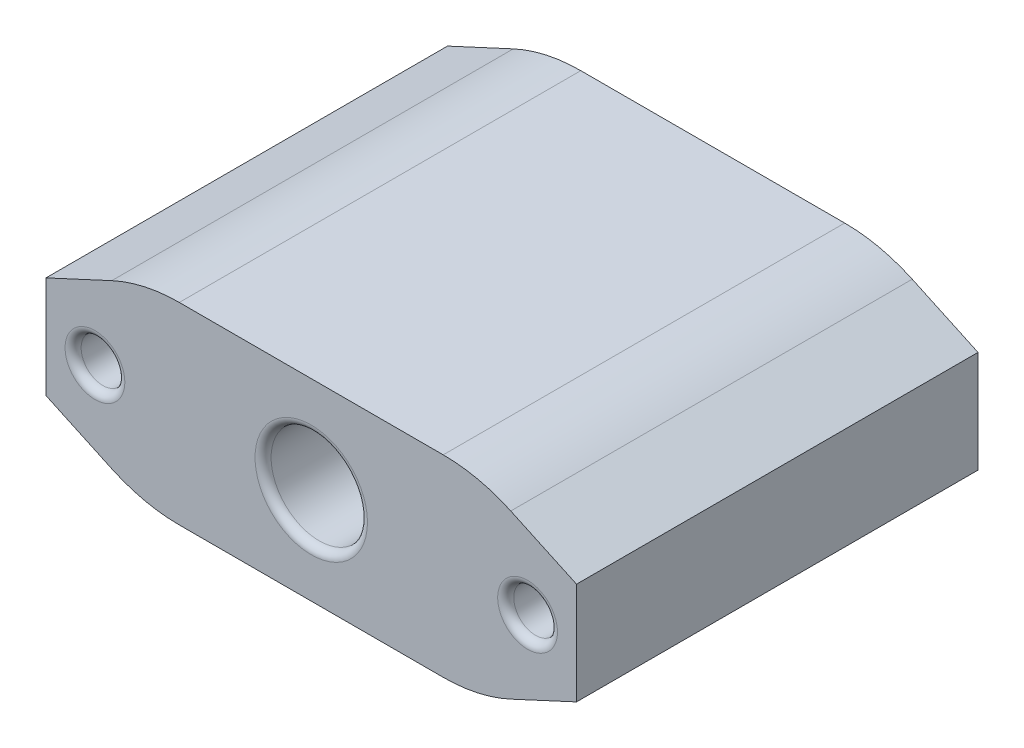
ISO-10303-21;
HEADER;
FILE_DESCRIPTION(('STEP AP214'),'2;1');
FILE_NAME('part.step','',(''),(''),'','','');
FILE_SCHEMA(('AUTOMOTIVE_DESIGN { 1 0 10303 214 1 1 1 1 }'));
ENDSEC;
DATA;
#1=APPLICATION_CONTEXT('core data for automotive mechanical design processes');
#2=APPLICATION_PROTOCOL_DEFINITION('international standard','automotive_design',2000,#1);
#3=PRODUCT_CONTEXT('',#1,'mechanical');
#4=PRODUCT('Part','Part','',(#3));
#5=PRODUCT_RELATED_PRODUCT_CATEGORY('part','',(#4));
#6=PRODUCT_DEFINITION_FORMATION('','',#4);
#7=PRODUCT_DEFINITION_CONTEXT('part definition',#1,'design');
#8=PRODUCT_DEFINITION('design','',#6,#7);
#9=PRODUCT_DEFINITION_SHAPE('','',#8);
#10=(LENGTH_UNIT() NAMED_UNIT(*) SI_UNIT(.MILLI.,.METRE.));
#11=(NAMED_UNIT(*) PLANE_ANGLE_UNIT() SI_UNIT($,.RADIAN.));
#12=(NAMED_UNIT(*) SI_UNIT($,.STERADIAN.) SOLID_ANGLE_UNIT());
#13=UNCERTAINTY_MEASURE_WITH_UNIT(LENGTH_MEASURE(1.E-05),#10,'distance_accuracy_value','');
#14=(GEOMETRIC_REPRESENTATION_CONTEXT(3) GLOBAL_UNCERTAINTY_ASSIGNED_CONTEXT((#13)) GLOBAL_UNIT_ASSIGNED_CONTEXT((#10,
#11,#12)) REPRESENTATION_CONTEXT('',''));
#15=CARTESIAN_POINT('',(0.,0.,0.));
#16=DIRECTION('',(0.,0.,1.));
#17=DIRECTION('',(1.,0.,0.));
#18=AXIS2_PLACEMENT_3D('',#15,#16,#17);
#19=CARTESIAN_POINT('',(0.,0.,25.));
#20=DIRECTION('',(0.,0.,1.));
#21=DIRECTION('',(1.,0.,0.));
#22=AXIS2_PLACEMENT_3D('',#19,#20,#21);
#23=PLANE('',#22);
#24=CARTESIAN_POINT('',(-13.4699746100887,0.,25.));
#25=DIRECTION('',(0.,0.,1.));
#26=DIRECTION('',(1.,0.,0.));
#27=AXIS2_PLACEMENT_3D('',#24,#25,#26);
#28=CIRCLE('',#27,1.8609341816038);
#29=CARTESIAN_POINT('',(-11.6090404284849,0.,25.));
#30=VERTEX_POINT('',#29);
#31=EDGE_CURVE('E11',#30,#30,#28,.F.);
#32=ORIENTED_EDGE('',*,*,#31,.T.);
#33=EDGE_LOOP('',(#32));
#34=FACE_BOUND('',#33,.T.);
#35=CARTESIAN_POINT('',(13.4699746100887,0.,25.));
#36=DIRECTION('',(0.,0.,1.));
#37=DIRECTION('',(1.,0.,0.));
#38=AXIS2_PLACEMENT_3D('',#35,#36,#37);
#39=CIRCLE('',#38,1.86093418160381);
#40=CARTESIAN_POINT('',(15.3309087916925,0.,25.));
#41=VERTEX_POINT('',#40);
#42=EDGE_CURVE('E250',#41,#41,#39,.F.);
#43=ORIENTED_EDGE('',*,*,#42,.T.);
#44=EDGE_LOOP('',(#43));
#45=FACE_BOUND('',#44,.T.);
#46=CARTESIAN_POINT('',(0.,0.,25.));
#47=DIRECTION('',(0.,0.,1.));
#48=DIRECTION('',(1.,0.,0.));
#49=AXIS2_PLACEMENT_3D('',#46,#47,#48);
#50=CIRCLE('',#49,3.5);
#51=CARTESIAN_POINT('',(3.5,0.,25.));
#52=VERTEX_POINT('',#51);
#53=EDGE_CURVE('E244',#52,#52,#50,.F.);
#54=ORIENTED_EDGE('',*,*,#53,.T.);
#55=EDGE_LOOP('',(#54));
#56=FACE_BOUND('',#55,.T.);
#57=DIRECTION('',(-0.907309221661338,0.420464001180003,0.));
#58=VECTOR('',#57,1.);
#59=CARTESIAN_POINT('',(16.5179746100887,3.17499999999998,25.));
#60=LINE('',#59,#58);
#61=CARTESIAN_POINT('',(16.5179746100887,3.17499999999998,25.));
#62=VERTEX_POINT('',#61);
#63=CARTESIAN_POINT('',(12.4221267685046,5.07309221661338,25.));
#64=VERTEX_POINT('',#63);
#65=EDGE_CURVE('E154',#62,#64,#60,.T.);
#66=ORIENTED_EDGE('',*,*,#65,.T.);
#67=CARTESIAN_POINT('',(8.21748675670452,-3.99999999999999,25.));
#68=DIRECTION('',(0.,0.,1.));
#69=DIRECTION('',(1.,0.,0.));
#70=AXIS2_PLACEMENT_3D('',#67,#68,#69);
#71=CIRCLE('',#70,10.);
#72=CARTESIAN_POINT('',(8.21748675670452,6.00000000000001,25.));
#73=VERTEX_POINT('',#72);
#74=EDGE_CURVE('E221',#64,#73,#71,.T.);
#75=ORIENTED_EDGE('',*,*,#74,.T.);
#76=DIRECTION('',(-1.,0.,0.));
#77=VECTOR('',#76,1.);
#78=CARTESIAN_POINT('',(-10.4219746100887,6.00000000000001,25.));
#79=LINE('',#78,#77);
#80=CARTESIAN_POINT('',(-8.21748675670453,6.00000000000001,25.));
#81=VERTEX_POINT('',#80);
#82=EDGE_CURVE('E156',#73,#81,#79,.T.);
#83=ORIENTED_EDGE('',*,*,#82,.T.);
#84=CARTESIAN_POINT('',(-8.21748675670453,-3.99999999999999,25.));
#85=DIRECTION('',(0.,0.,1.));
#86=DIRECTION('',(1.,0.,0.));
#87=AXIS2_PLACEMENT_3D('',#84,#85,#86);
#88=CIRCLE('',#87,10.);
#89=CARTESIAN_POINT('',(-12.4221267685046,5.07309221661338,25.));
#90=VERTEX_POINT('',#89);
#91=EDGE_CURVE('E198',#81,#90,#88,.T.);
#92=ORIENTED_EDGE('',*,*,#91,.T.);
#93=DIRECTION('',(-0.907309221661338,-0.420464001180003,0.));
#94=VECTOR('',#93,1.);
#95=CARTESIAN_POINT('',(-16.5179746100887,3.17499999999998,25.));
#96=LINE('',#95,#94);
#97=CARTESIAN_POINT('',(-16.5179746100887,3.17499999999998,25.));
#98=VERTEX_POINT('',#97);
#99=EDGE_CURVE('E161',#90,#98,#96,.T.);
#100=ORIENTED_EDGE('',*,*,#99,.T.);
#101=DIRECTION('',(0.,-1.,0.));
#102=VECTOR('',#101,1.);
#103=CARTESIAN_POINT('',(-16.5179746100887,-3.17500000000004,25.));
#104=LINE('',#103,#102);
#105=CARTESIAN_POINT('',(-16.5179746100887,-3.17500000000004,25.));
#106=VERTEX_POINT('',#105);
#107=EDGE_CURVE('E163',#98,#106,#104,.T.);
#108=ORIENTED_EDGE('',*,*,#107,.T.);
#109=DIRECTION('',(0.907309221661341,-0.420464001179996,0.));
#110=VECTOR('',#109,1.);
#111=CARTESIAN_POINT('',(-16.5179746100887,-3.17500000000004,25.));
#112=LINE('',#111,#110);
#113=CARTESIAN_POINT('',(-12.4221267685045,-5.07309221661342,25.));
#114=VERTEX_POINT('',#113);
#115=EDGE_CURVE('E183',#106,#114,#112,.T.);
#116=ORIENTED_EDGE('',*,*,#115,.T.);
#117=CARTESIAN_POINT('',(-8.21748675670456,3.99999999999999,25.));
#118=DIRECTION('',(0.,0.,1.));
#119=DIRECTION('',(1.,0.,0.));
#120=AXIS2_PLACEMENT_3D('',#117,#118,#119);
#121=CIRCLE('',#120,10.);
#122=CARTESIAN_POINT('',(-8.21748675670456,-6.00000000000001,25.));
#123=VERTEX_POINT('',#122);
#124=EDGE_CURVE('E207',#114,#123,#121,.T.);
#125=ORIENTED_EDGE('',*,*,#124,.T.);
#126=DIRECTION('',(1.,0.,0.));
#127=VECTOR('',#126,1.);
#128=CARTESIAN_POINT('',(-10.4219746100887,-6.00000000000001,25.));
#129=LINE('',#128,#127);
#130=CARTESIAN_POINT('',(8.21748675670456,-6.00000000000001,25.));
#131=VERTEX_POINT('',#130);
#132=EDGE_CURVE('E140',#123,#131,#129,.T.);
#133=ORIENTED_EDGE('',*,*,#132,.T.);
#134=CARTESIAN_POINT('',(8.21748675670456,3.99999999999999,25.));
#135=DIRECTION('',(0.,0.,1.));
#136=DIRECTION('',(1.,0.,0.));
#137=AXIS2_PLACEMENT_3D('',#134,#135,#136);
#138=CIRCLE('',#137,10.);
#139=CARTESIAN_POINT('',(12.4221267685045,-5.07309221661342,25.));
#140=VERTEX_POINT('',#139);
#141=EDGE_CURVE('E136',#131,#140,#138,.T.);
#142=ORIENTED_EDGE('',*,*,#141,.T.);
#143=DIRECTION('',(0.907309221661341,0.420464001179996,0.));
#144=VECTOR('',#143,1.);
#145=CARTESIAN_POINT('',(16.5179746100887,-3.17500000000004,25.));
#146=LINE('',#145,#144);
#147=CARTESIAN_POINT('',(16.5179746100887,-3.17500000000004,25.));
#148=VERTEX_POINT('',#147);
#149=EDGE_CURVE('E129',#140,#148,#146,.T.);
#150=ORIENTED_EDGE('',*,*,#149,.T.);
#151=DIRECTION('',(0.,1.,0.));
#152=VECTOR('',#151,1.);
#153=CARTESIAN_POINT('',(16.5179746100887,-3.17500000000004,25.));
#154=LINE('',#153,#152);
#155=EDGE_CURVE('E132',#148,#62,#154,.T.);
#156=ORIENTED_EDGE('',*,*,#155,.T.);
#157=EDGE_LOOP('',(#66,#75,#83,#92,#100,#108,#116,#125,#133,#142,#150,#156));
#158=FACE_BOUND('',#157,.T.);
#159=ADVANCED_FACE('F39',(#34,#45,#56,#158),#23,.T.);
#160=CARTESIAN_POINT('',(0.,0.,0.));
#161=DIRECTION('',(0.,0.,1.));
#162=DIRECTION('',(1.,0.,0.));
#163=AXIS2_PLACEMENT_3D('',#160,#161,#162);
#164=PLANE('',#163);
#165=CARTESIAN_POINT('',(-13.4699746100887,0.,0.));
#166=DIRECTION('',(0.,0.,1.));
#167=DIRECTION('',(1.,0.,0.));
#168=AXIS2_PLACEMENT_3D('',#165,#166,#167);
#169=CIRCLE('',#168,1.8609341816038);
#170=CARTESIAN_POINT('',(-11.6090404284849,0.,0.));
#171=VERTEX_POINT('',#170);
#172=EDGE_CURVE('E235',#171,#171,#169,.T.);
#173=ORIENTED_EDGE('',*,*,#172,.T.);
#174=EDGE_LOOP('',(#173));
#175=FACE_BOUND('',#174,.T.);
#176=CARTESIAN_POINT('',(13.4699746100887,0.,0.));
#177=DIRECTION('',(0.,0.,1.));
#178=DIRECTION('',(1.,0.,0.));
#179=AXIS2_PLACEMENT_3D('',#176,#177,#178);
#180=CIRCLE('',#179,1.86093418160381);
#181=CARTESIAN_POINT('',(15.3309087916925,0.,0.));
#182=VERTEX_POINT('',#181);
#183=EDGE_CURVE('E229',#182,#182,#180,.T.);
#184=ORIENTED_EDGE('',*,*,#183,.T.);
#185=EDGE_LOOP('',(#184));
#186=FACE_BOUND('',#185,.T.);
#187=CARTESIAN_POINT('',(0.,0.,0.));
#188=DIRECTION('',(0.,0.,1.));
#189=DIRECTION('',(1.,0.,0.));
#190=AXIS2_PLACEMENT_3D('',#187,#188,#189);
#191=CIRCLE('',#190,3.5);
#192=CARTESIAN_POINT('',(3.5,0.,0.));
#193=VERTEX_POINT('',#192);
#194=EDGE_CURVE('E223',#193,#193,#191,.T.);
#195=ORIENTED_EDGE('',*,*,#194,.T.);
#196=EDGE_LOOP('',(#195));
#197=FACE_BOUND('',#196,.T.);
#198=DIRECTION('',(-1.,0.,0.));
#199=VECTOR('',#198,1.);
#200=CARTESIAN_POINT('',(-10.4219746100887,6.00000000000001,0.));
#201=LINE('',#200,#199);
#202=CARTESIAN_POINT('',(8.21748675670452,6.00000000000001,0.));
#203=VERTEX_POINT('',#202);
#204=CARTESIAN_POINT('',(-8.21748675670453,6.00000000000001,0.));
#205=VERTEX_POINT('',#204);
#206=EDGE_CURVE('E177',#203,#205,#201,.T.);
#207=ORIENTED_EDGE('',*,*,#206,.F.);
#208=CARTESIAN_POINT('',(8.21748675670452,-3.99999999999999,0.));
#209=DIRECTION('',(0.,0.,1.));
#210=DIRECTION('',(1.,0.,0.));
#211=AXIS2_PLACEMENT_3D('',#208,#209,#210);
#212=CIRCLE('',#211,10.);
#213=CARTESIAN_POINT('',(12.4221267685046,5.07309221661338,0.));
#214=VERTEX_POINT('',#213);
#215=EDGE_CURVE('E62',#203,#214,#212,.F.);
#216=ORIENTED_EDGE('',*,*,#215,.T.);
#217=DIRECTION('',(-0.907309221661338,0.420464001180003,0.));
#218=VECTOR('',#217,1.);
#219=CARTESIAN_POINT('',(16.5179746100887,3.17499999999998,0.));
#220=LINE('',#219,#218);
#221=CARTESIAN_POINT('',(16.5179746100887,3.17499999999998,0.));
#222=VERTEX_POINT('',#221);
#223=EDGE_CURVE('E175',#222,#214,#220,.T.);
#224=ORIENTED_EDGE('',*,*,#223,.F.);
#225=DIRECTION('',(0.,1.,0.));
#226=VECTOR('',#225,1.);
#227=CARTESIAN_POINT('',(16.5179746100887,-3.17500000000004,0.));
#228=LINE('',#227,#226);
#229=CARTESIAN_POINT('',(16.5179746100887,-3.17500000000004,0.));
#230=VERTEX_POINT('',#229);
#231=EDGE_CURVE('E173',#230,#222,#228,.T.);
#232=ORIENTED_EDGE('',*,*,#231,.F.);
#233=DIRECTION('',(0.907309221661341,0.420464001179996,0.));
#234=VECTOR('',#233,1.);
#235=CARTESIAN_POINT('',(16.5179746100887,-3.17500000000004,0.));
#236=LINE('',#235,#234);
#237=CARTESIAN_POINT('',(12.4221267685045,-5.07309221661342,0.));
#238=VERTEX_POINT('',#237);
#239=EDGE_CURVE('E146',#238,#230,#236,.T.);
#240=ORIENTED_EDGE('',*,*,#239,.F.);
#241=CARTESIAN_POINT('',(8.21748675670456,3.99999999999999,0.));
#242=DIRECTION('',(0.,0.,1.));
#243=DIRECTION('',(1.,0.,0.));
#244=AXIS2_PLACEMENT_3D('',#241,#242,#243);
#245=CIRCLE('',#244,10.);
#246=CARTESIAN_POINT('',(8.21748675670456,-6.00000000000001,0.));
#247=VERTEX_POINT('',#246);
#248=EDGE_CURVE('E211',#238,#247,#245,.F.);
#249=ORIENTED_EDGE('',*,*,#248,.T.);
#250=DIRECTION('',(1.,0.,0.));
#251=VECTOR('',#250,1.);
#252=CARTESIAN_POINT('',(-10.4219746100887,-6.00000000000001,0.));
#253=LINE('',#252,#251);
#254=CARTESIAN_POINT('',(-8.21748675670456,-6.00000000000001,0.));
#255=VERTEX_POINT('',#254);
#256=EDGE_CURVE('E169',#255,#247,#253,.T.);
#257=ORIENTED_EDGE('',*,*,#256,.F.);
#258=CARTESIAN_POINT('',(-8.21748675670456,3.99999999999999,0.));
#259=DIRECTION('',(0.,0.,1.));
#260=DIRECTION('',(1.,0.,0.));
#261=AXIS2_PLACEMENT_3D('',#258,#259,#260);
#262=CIRCLE('',#261,10.);
#263=CARTESIAN_POINT('',(-12.4221267685045,-5.07309221661342,0.));
#264=VERTEX_POINT('',#263);
#265=EDGE_CURVE('E203',#255,#264,#262,.F.);
#266=ORIENTED_EDGE('',*,*,#265,.T.);
#267=DIRECTION('',(0.907309221661341,-0.420464001179996,0.));
#268=VECTOR('',#267,1.);
#269=CARTESIAN_POINT('',(-16.5179746100887,-3.17500000000004,0.));
#270=LINE('',#269,#268);
#271=CARTESIAN_POINT('',(-16.5179746100887,-3.17500000000004,0.));
#272=VERTEX_POINT('',#271);
#273=EDGE_CURVE('E166',#272,#264,#270,.T.);
#274=ORIENTED_EDGE('',*,*,#273,.F.);
#275=DIRECTION('',(0.,-1.,0.));
#276=VECTOR('',#275,1.);
#277=CARTESIAN_POINT('',(-16.5179746100887,-3.17500000000004,0.));
#278=LINE('',#277,#276);
#279=CARTESIAN_POINT('',(-16.5179746100887,3.17499999999998,0.));
#280=VERTEX_POINT('',#279);
#281=EDGE_CURVE('E181',#280,#272,#278,.T.);
#282=ORIENTED_EDGE('',*,*,#281,.F.);
#283=DIRECTION('',(-0.907309221661338,-0.420464001180003,0.));
#284=VECTOR('',#283,1.);
#285=CARTESIAN_POINT('',(-16.5179746100887,3.17499999999998,0.));
#286=LINE('',#285,#284);
#287=CARTESIAN_POINT('',(-12.4221267685046,5.07309221661338,0.));
#288=VERTEX_POINT('',#287);
#289=EDGE_CURVE('E179',#288,#280,#286,.T.);
#290=ORIENTED_EDGE('',*,*,#289,.F.);
#291=CARTESIAN_POINT('',(-8.21748675670453,-3.99999999999999,0.));
#292=DIRECTION('',(0.,0.,1.));
#293=DIRECTION('',(1.,0.,0.));
#294=AXIS2_PLACEMENT_3D('',#291,#292,#293);
#295=CIRCLE('',#294,10.);
#296=EDGE_CURVE('E192',#288,#205,#295,.F.);
#297=ORIENTED_EDGE('',*,*,#296,.T.);
#298=EDGE_LOOP('',(#207,#216,#224,#232,#240,#249,#257,#266,#274,#282,#290,#297));
#299=FACE_BOUND('',#298,.T.);
#300=ADVANCED_FACE('F268',(#175,#186,#197,#299),#164,.F.);
#301=CARTESIAN_POINT('',(-16.5179746100887,-3.17500000000004,25.));
#302=DIRECTION('',(0.420464001179996,0.907309221661341,0.));
#303=DIRECTION('',(-0.907309221661341,0.420464001179996,0.));
#304=AXIS2_PLACEMENT_3D('',#301,#302,#303);
#305=PLANE('',#304);
#306=ORIENTED_EDGE('',*,*,#273,.T.);
#307=DIRECTION('',(0.,0.,-1.));
#308=VECTOR('',#307,1.);
#309=CARTESIAN_POINT('',(-12.4221267685045,-5.07309221661342,25.));
#310=LINE('',#309,#308);
#311=EDGE_CURVE('E205',#264,#114,#310,.F.);
#312=ORIENTED_EDGE('',*,*,#311,.T.);
#313=ORIENTED_EDGE('',*,*,#115,.F.);
#314=DIRECTION('',(0.,0.,-1.));
#315=VECTOR('',#314,1.);
#316=CARTESIAN_POINT('',(-16.5179746100887,-3.17500000000004,25.));
#317=LINE('',#316,#315);
#318=EDGE_CURVE('E165',#106,#272,#317,.T.);
#319=ORIENTED_EDGE('',*,*,#318,.T.);
#320=EDGE_LOOP('',(#306,#312,#313,#319));
#321=FACE_BOUND('',#320,.T.);
#322=ADVANCED_FACE('F274',(#321),#305,.F.);
#323=CARTESIAN_POINT('',(-10.4219746100887,-6.00000000000001,25.));
#324=DIRECTION('',(0.,1.,0.));
#325=DIRECTION('',(0.,0.,1.));
#326=AXIS2_PLACEMENT_3D('',#323,#324,#325);
#327=PLANE('',#326);
#328=ORIENTED_EDGE('',*,*,#256,.T.);
#329=DIRECTION('',(0.,0.,-1.));
#330=VECTOR('',#329,1.);
#331=CARTESIAN_POINT('',(8.21748675670456,-6.00000000000001,25.));
#332=LINE('',#331,#330);
#333=EDGE_CURVE('E213',#247,#131,#332,.F.);
#334=ORIENTED_EDGE('',*,*,#333,.T.);
#335=ORIENTED_EDGE('',*,*,#132,.F.);
#336=DIRECTION('',(0.,0.,-1.));
#337=VECTOR('',#336,1.);
#338=CARTESIAN_POINT('',(-8.21748675670456,-6.00000000000001,25.));
#339=LINE('',#338,#337);
#340=EDGE_CURVE('E200',#123,#255,#339,.T.);
#341=ORIENTED_EDGE('',*,*,#340,.T.);
#342=EDGE_LOOP('',(#328,#334,#335,#341));
#343=FACE_BOUND('',#342,.T.);
#344=ADVANCED_FACE('F301',(#343),#327,.F.);
#345=CARTESIAN_POINT('',(16.5179746100887,-3.17500000000004,25.));
#346=DIRECTION('',(-0.420464001179996,0.907309221661341,0.));
#347=DIRECTION('',(-0.907309221661341,-0.420464001179996,0.));
#348=AXIS2_PLACEMENT_3D('',#345,#346,#347);
#349=PLANE('',#348);
#350=ORIENTED_EDGE('',*,*,#149,.F.);
#351=DIRECTION('',(0.,0.,-1.));
#352=VECTOR('',#351,1.);
#353=CARTESIAN_POINT('',(12.4221267685045,-5.07309221661342,25.));
#354=LINE('',#353,#352);
#355=EDGE_CURVE('E209',#140,#238,#354,.T.);
#356=ORIENTED_EDGE('',*,*,#355,.T.);
#357=ORIENTED_EDGE('',*,*,#239,.T.);
#358=DIRECTION('',(0.,0.,-1.));
#359=VECTOR('',#358,1.);
#360=CARTESIAN_POINT('',(16.5179746100887,-3.17500000000004,25.));
#361=LINE('',#360,#359);
#362=EDGE_CURVE('E143',#148,#230,#361,.T.);
#363=ORIENTED_EDGE('',*,*,#362,.F.);
#364=EDGE_LOOP('',(#350,#356,#357,#363));
#365=FACE_BOUND('',#364,.T.);
#366=ADVANCED_FACE('F144',(#365),#349,.F.);
#367=CARTESIAN_POINT('',(16.5179746100887,-3.17500000000004,25.));
#368=DIRECTION('',(-1.,0.,0.));
#369=DIRECTION('',(0.,-1.,0.));
#370=AXIS2_PLACEMENT_3D('',#367,#368,#369);
#371=PLANE('',#370);
#372=ORIENTED_EDGE('',*,*,#231,.T.);
#373=DIRECTION('',(0.,0.,-1.));
#374=VECTOR('',#373,1.);
#375=CARTESIAN_POINT('',(16.5179746100887,3.17499999999998,25.));
#376=LINE('',#375,#374);
#377=EDGE_CURVE('E150',#62,#222,#376,.T.);
#378=ORIENTED_EDGE('',*,*,#377,.F.);
#379=ORIENTED_EDGE('',*,*,#155,.F.);
#380=ORIENTED_EDGE('',*,*,#362,.T.);
#381=EDGE_LOOP('',(#372,#378,#379,#380));
#382=FACE_BOUND('',#381,.T.);
#383=ADVANCED_FACE('F152',(#382),#371,.F.);
#384=CARTESIAN_POINT('',(16.5179746100887,3.17499999999998,25.));
#385=DIRECTION('',(-0.420464001180003,-0.907309221661338,0.));
#386=DIRECTION('',(0.907309221661338,-0.420464001180003,0.));
#387=AXIS2_PLACEMENT_3D('',#384,#385,#386);
#388=PLANE('',#387);
#389=ORIENTED_EDGE('',*,*,#223,.T.);
#390=DIRECTION('',(0.,0.,-1.));
#391=VECTOR('',#390,1.);
#392=CARTESIAN_POINT('',(12.4221267685046,5.07309221661338,25.));
#393=LINE('',#392,#391);
#394=EDGE_CURVE('E54',#214,#64,#393,.F.);
#395=ORIENTED_EDGE('',*,*,#394,.T.);
#396=ORIENTED_EDGE('',*,*,#65,.F.);
#397=ORIENTED_EDGE('',*,*,#377,.T.);
#398=EDGE_LOOP('',(#389,#395,#396,#397));
#399=FACE_BOUND('',#398,.T.);
#400=ADVANCED_FACE('F293',(#399),#388,.F.);
#401=CARTESIAN_POINT('',(-10.4219746100887,6.00000000000001,25.));
#402=DIRECTION('',(0.,-1.,0.));
#403=DIRECTION('',(0.,0.,-1.));
#404=AXIS2_PLACEMENT_3D('',#401,#402,#403);
#405=PLANE('',#404);
#406=ORIENTED_EDGE('',*,*,#82,.F.);
#407=DIRECTION('',(0.,0.,-1.));
#408=VECTOR('',#407,1.);
#409=CARTESIAN_POINT('',(8.21748675670452,6.00000000000001,25.));
#410=LINE('',#409,#408);
#411=EDGE_CURVE('E216',#73,#203,#410,.T.);
#412=ORIENTED_EDGE('',*,*,#411,.T.);
#413=ORIENTED_EDGE('',*,*,#206,.T.);
#414=DIRECTION('',(0.,0.,-1.));
#415=VECTOR('',#414,1.);
#416=CARTESIAN_POINT('',(-8.21748675670453,6.00000000000001,25.));
#417=LINE('',#416,#415);
#418=EDGE_CURVE('E195',#205,#81,#417,.F.);
#419=ORIENTED_EDGE('',*,*,#418,.T.);
#420=EDGE_LOOP('',(#406,#412,#413,#419));
#421=FACE_BOUND('',#420,.T.);
#422=ADVANCED_FACE('F289',(#421),#405,.F.);
#423=CARTESIAN_POINT('',(-16.5179746100887,3.17499999999998,25.));
#424=DIRECTION('',(0.420464001180003,-0.907309221661338,0.));
#425=DIRECTION('',(0.907309221661338,0.420464001180003,0.));
#426=AXIS2_PLACEMENT_3D('',#423,#424,#425);
#427=PLANE('',#426);
#428=ORIENTED_EDGE('',*,*,#99,.F.);
#429=DIRECTION('',(0.,0.,-1.));
#430=VECTOR('',#429,1.);
#431=CARTESIAN_POINT('',(-12.4221267685046,5.07309221661338,25.));
#432=LINE('',#431,#430);
#433=EDGE_CURVE('E149',#90,#288,#432,.T.);
#434=ORIENTED_EDGE('',*,*,#433,.T.);
#435=ORIENTED_EDGE('',*,*,#289,.T.);
#436=DIRECTION('',(0.,0.,-1.));
#437=VECTOR('',#436,1.);
#438=CARTESIAN_POINT('',(-16.5179746100887,3.17499999999998,25.));
#439=LINE('',#438,#437);
#440=EDGE_CURVE('E186',#98,#280,#439,.T.);
#441=ORIENTED_EDGE('',*,*,#440,.F.);
#442=EDGE_LOOP('',(#428,#434,#435,#441));
#443=FACE_BOUND('',#442,.T.);
#444=ADVANCED_FACE('F285',(#443),#427,.F.);
#445=CARTESIAN_POINT('',(-16.5179746100887,-3.17500000000004,25.));
#446=DIRECTION('',(1.,0.,0.));
#447=DIRECTION('',(0.,1.,0.));
#448=AXIS2_PLACEMENT_3D('',#445,#446,#447);
#449=PLANE('',#448);
#450=ORIENTED_EDGE('',*,*,#281,.T.);
#451=ORIENTED_EDGE('',*,*,#318,.F.);
#452=ORIENTED_EDGE('',*,*,#107,.F.);
#453=ORIENTED_EDGE('',*,*,#440,.T.);
#454=EDGE_LOOP('',(#450,#451,#452,#453));
#455=FACE_BOUND('',#454,.T.);
#456=ADVANCED_FACE('F282',(#455),#449,.F.);
#457=CARTESIAN_POINT('',(13.4699746100887,0.,25.));
#458=DIRECTION('',(0.,0.,-1.));
#459=DIRECTION('',(-1.,0.,0.));
#460=AXIS2_PLACEMENT_3D('',#457,#458,#459);
#461=CYLINDRICAL_SURFACE('',#460,1.36093418160381);
#462=CARTESIAN_POINT('',(13.4699746100887,0.,24.5));
#463=DIRECTION('',(0.,0.,1.));
#464=DIRECTION('',(1.,0.,0.));
#465=AXIS2_PLACEMENT_3D('',#462,#463,#464);
#466=CIRCLE('',#465,1.36093418160381);
#467=CARTESIAN_POINT('',(14.8309087916925,0.,24.5));
#468=VERTEX_POINT('',#467);
#469=EDGE_CURVE('E247',#468,#468,#466,.T.);
#470=ORIENTED_EDGE('',*,*,#469,.T.);
#471=EDGE_LOOP('',(#470));
#472=FACE_BOUND('',#471,.T.);
#473=CARTESIAN_POINT('',(13.4699746100887,0.,0.5));
#474=DIRECTION('',(0.,0.,1.));
#475=DIRECTION('',(1.,0.,0.));
#476=AXIS2_PLACEMENT_3D('',#473,#474,#475);
#477=CIRCLE('',#476,1.36093418160381);
#478=CARTESIAN_POINT('',(14.8309087916925,0.,0.5));
#479=VERTEX_POINT('',#478);
#480=EDGE_CURVE('E232',#479,#479,#477,.F.);
#481=ORIENTED_EDGE('',*,*,#480,.T.);
#482=EDGE_LOOP('',(#481));
#483=FACE_BOUND('',#482,.T.);
#484=ADVANCED_FACE('F279',(#472,#483),#461,.F.);
#485=CARTESIAN_POINT('',(-13.4699746100887,0.,25.));
#486=DIRECTION('',(0.,0.,-1.));
#487=DIRECTION('',(-1.,0.,0.));
#488=AXIS2_PLACEMENT_3D('',#485,#486,#487);
#489=CYLINDRICAL_SURFACE('',#488,1.3609341816038);
#490=CARTESIAN_POINT('',(-13.4699746100887,0.,24.5));
#491=DIRECTION('',(0.,0.,1.));
#492=DIRECTION('',(1.,0.,0.));
#493=AXIS2_PLACEMENT_3D('',#490,#491,#492);
#494=CIRCLE('',#493,1.3609341816038);
#495=CARTESIAN_POINT('',(-12.1090404284849,0.,24.5));
#496=VERTEX_POINT('',#495);
#497=EDGE_CURVE('E47',#496,#496,#494,.T.);
#498=ORIENTED_EDGE('',*,*,#497,.T.);
#499=EDGE_LOOP('',(#498));
#500=FACE_BOUND('',#499,.T.);
#501=CARTESIAN_POINT('',(-13.4699746100887,0.,0.5));
#502=DIRECTION('',(0.,0.,1.));
#503=DIRECTION('',(1.,0.,0.));
#504=AXIS2_PLACEMENT_3D('',#501,#502,#503);
#505=CIRCLE('',#504,1.3609341816038);
#506=CARTESIAN_POINT('',(-12.1090404284849,0.,0.5));
#507=VERTEX_POINT('',#506);
#508=EDGE_CURVE('E238',#507,#507,#505,.F.);
#509=ORIENTED_EDGE('',*,*,#508,.T.);
#510=EDGE_LOOP('',(#509));
#511=FACE_BOUND('',#510,.T.);
#512=ADVANCED_FACE('F255',(#500,#511),#489,.F.);
#513=CARTESIAN_POINT('',(0.,0.,25.));
#514=DIRECTION('',(0.,0.,-1.));
#515=DIRECTION('',(-1.,0.,0.));
#516=AXIS2_PLACEMENT_3D('',#513,#514,#515);
#517=CYLINDRICAL_SURFACE('',#516,3.);
#518=CARTESIAN_POINT('',(0.,0.,24.5));
#519=DIRECTION('',(0.,0.,1.));
#520=DIRECTION('',(1.,0.,0.));
#521=AXIS2_PLACEMENT_3D('',#518,#519,#520);
#522=CIRCLE('',#521,3.);
#523=CARTESIAN_POINT('',(3.,0.,24.5));
#524=VERTEX_POINT('',#523);
#525=EDGE_CURVE('E241',#524,#524,#522,.T.);
#526=ORIENTED_EDGE('',*,*,#525,.T.);
#527=EDGE_LOOP('',(#526));
#528=FACE_BOUND('',#527,.T.);
#529=CARTESIAN_POINT('',(0.,0.,0.5));
#530=DIRECTION('',(0.,0.,1.));
#531=DIRECTION('',(1.,0.,0.));
#532=AXIS2_PLACEMENT_3D('',#529,#530,#531);
#533=CIRCLE('',#532,3.);
#534=CARTESIAN_POINT('',(3.,0.,0.5));
#535=VERTEX_POINT('',#534);
#536=EDGE_CURVE('E226',#535,#535,#533,.F.);
#537=ORIENTED_EDGE('',*,*,#536,.T.);
#538=EDGE_LOOP('',(#537));
#539=FACE_BOUND('',#538,.T.);
#540=ADVANCED_FACE('F312',(#528,#539),#517,.F.);
#541=CARTESIAN_POINT('',(-8.21748675670453,-3.99999999999999,25.));
#542=DIRECTION('',(0.,0.,-1.));
#543=DIRECTION('',(-1.,0.,0.));
#544=AXIS2_PLACEMENT_3D('',#541,#542,#543);
#545=CYLINDRICAL_SURFACE('',#544,10.);
#546=ORIENTED_EDGE('',*,*,#91,.F.);
#547=ORIENTED_EDGE('',*,*,#418,.F.);
#548=ORIENTED_EDGE('',*,*,#296,.F.);
#549=ORIENTED_EDGE('',*,*,#433,.F.);
#550=EDGE_LOOP('',(#546,#547,#548,#549));
#551=FACE_BOUND('',#550,.T.);
#552=ADVANCED_FACE('F308',(#551),#545,.T.);
#553=CARTESIAN_POINT('',(-8.21748675670456,3.99999999999999,25.));
#554=DIRECTION('',(0.,0.,-1.));
#555=DIRECTION('',(-1.,0.,0.));
#556=AXIS2_PLACEMENT_3D('',#553,#554,#555);
#557=CYLINDRICAL_SURFACE('',#556,10.);
#558=ORIENTED_EDGE('',*,*,#124,.F.);
#559=ORIENTED_EDGE('',*,*,#311,.F.);
#560=ORIENTED_EDGE('',*,*,#265,.F.);
#561=ORIENTED_EDGE('',*,*,#340,.F.);
#562=EDGE_LOOP('',(#558,#559,#560,#561));
#563=FACE_BOUND('',#562,.T.);
#564=ADVANCED_FACE('F311',(#563),#557,.T.);
#565=CARTESIAN_POINT('',(8.21748675670456,3.99999999999999,25.));
#566=DIRECTION('',(0.,0.,-1.));
#567=DIRECTION('',(-1.,0.,0.));
#568=AXIS2_PLACEMENT_3D('',#565,#566,#567);
#569=CYLINDRICAL_SURFACE('',#568,10.);
#570=ORIENTED_EDGE('',*,*,#141,.F.);
#571=ORIENTED_EDGE('',*,*,#333,.F.);
#572=ORIENTED_EDGE('',*,*,#248,.F.);
#573=ORIENTED_EDGE('',*,*,#355,.F.);
#574=EDGE_LOOP('',(#570,#571,#572,#573));
#575=FACE_BOUND('',#574,.T.);
#576=ADVANCED_FACE('F316',(#575),#569,.T.);
#577=CARTESIAN_POINT('',(8.21748675670452,-3.99999999999999,25.));
#578=DIRECTION('',(0.,0.,-1.));
#579=DIRECTION('',(-1.,0.,0.));
#580=AXIS2_PLACEMENT_3D('',#577,#578,#579);
#581=CYLINDRICAL_SURFACE('',#580,10.);
#582=ORIENTED_EDGE('',*,*,#74,.F.);
#583=ORIENTED_EDGE('',*,*,#394,.F.);
#584=ORIENTED_EDGE('',*,*,#215,.F.);
#585=ORIENTED_EDGE('',*,*,#411,.F.);
#586=EDGE_LOOP('',(#582,#583,#584,#585));
#587=FACE_BOUND('',#586,.T.);
#588=ADVANCED_FACE('F320',(#587),#581,.T.);
#589=CARTESIAN_POINT('',(0.,0.,0.5));
#590=DIRECTION('',(0.,0.,1.));
#591=DIRECTION('',(1.,0.,0.));
#592=AXIS2_PLACEMENT_3D('',#589,#590,#591);
#593=TOROIDAL_SURFACE('',#592,3.5,0.5);
#594=ORIENTED_EDGE('',*,*,#536,.F.);
#595=EDGE_LOOP('',(#594));
#596=FACE_BOUND('',#595,.T.);
#597=ORIENTED_EDGE('',*,*,#194,.F.);
#598=EDGE_LOOP('',(#597));
#599=FACE_BOUND('',#598,.T.);
#600=ADVANCED_FACE('F324',(#596,#599),#593,.T.);
#601=CARTESIAN_POINT('',(13.4699746100887,0.,0.5));
#602=DIRECTION('',(0.,0.,1.));
#603=DIRECTION('',(1.,0.,0.));
#604=AXIS2_PLACEMENT_3D('',#601,#602,#603);
#605=TOROIDAL_SURFACE('',#604,1.86093418160381,0.5);
#606=ORIENTED_EDGE('',*,*,#480,.F.);
#607=EDGE_LOOP('',(#606));
#608=FACE_BOUND('',#607,.T.);
#609=ORIENTED_EDGE('',*,*,#183,.F.);
#610=EDGE_LOOP('',(#609));
#611=FACE_BOUND('',#610,.T.);
#612=ADVANCED_FACE('F328',(#608,#611),#605,.T.);
#613=CARTESIAN_POINT('',(-13.4699746100887,0.,0.5));
#614=DIRECTION('',(0.,0.,1.));
#615=DIRECTION('',(1.,0.,0.));
#616=AXIS2_PLACEMENT_3D('',#613,#614,#615);
#617=TOROIDAL_SURFACE('',#616,1.8609341816038,0.5);
#618=ORIENTED_EDGE('',*,*,#508,.F.);
#619=EDGE_LOOP('',(#618));
#620=FACE_BOUND('',#619,.T.);
#621=ORIENTED_EDGE('',*,*,#172,.F.);
#622=EDGE_LOOP('',(#621));
#623=FACE_BOUND('',#622,.T.);
#624=ADVANCED_FACE('F332',(#620,#623),#617,.T.);
#625=CARTESIAN_POINT('',(0.,0.,24.5));
#626=DIRECTION('',(0.,0.,1.));
#627=DIRECTION('',(1.,0.,0.));
#628=AXIS2_PLACEMENT_3D('',#625,#626,#627);
#629=TOROIDAL_SURFACE('',#628,3.5,0.5);
#630=ORIENTED_EDGE('',*,*,#53,.F.);
#631=EDGE_LOOP('',(#630));
#632=FACE_BOUND('',#631,.T.);
#633=ORIENTED_EDGE('',*,*,#525,.F.);
#634=EDGE_LOOP('',(#633));
#635=FACE_BOUND('',#634,.T.);
#636=ADVANCED_FACE('F264',(#632,#635),#629,.T.);
#637=CARTESIAN_POINT('',(13.4699746100887,0.,24.5));
#638=DIRECTION('',(0.,0.,1.));
#639=DIRECTION('',(1.,0.,0.));
#640=AXIS2_PLACEMENT_3D('',#637,#638,#639);
#641=TOROIDAL_SURFACE('',#640,1.86093418160381,0.5);
#642=ORIENTED_EDGE('',*,*,#42,.F.);
#643=EDGE_LOOP('',(#642));
#644=FACE_BOUND('',#643,.T.);
#645=ORIENTED_EDGE('',*,*,#469,.F.);
#646=EDGE_LOOP('',(#645));
#647=FACE_BOUND('',#646,.T.);
#648=ADVANCED_FACE('F259',(#644,#647),#641,.T.);
#649=CARTESIAN_POINT('',(-13.4699746100887,0.,24.5));
#650=DIRECTION('',(0.,0.,1.));
#651=DIRECTION('',(1.,0.,0.));
#652=AXIS2_PLACEMENT_3D('',#649,#650,#651);
#653=TOROIDAL_SURFACE('',#652,1.8609341816038,0.5);
#654=ORIENTED_EDGE('',*,*,#31,.F.);
#655=EDGE_LOOP('',(#654));
#656=FACE_BOUND('',#655,.T.);
#657=ORIENTED_EDGE('',*,*,#497,.F.);
#658=EDGE_LOOP('',(#657));
#659=FACE_BOUND('',#658,.T.);
#660=ADVANCED_FACE('F41',(#656,#659),#653,.T.);
#661=CLOSED_SHELL('',(#159,#300,#322,#344,#366,#383,#400,#422,#444,#456,#484,#512,#540,#552,
#564,#576,#588,#600,#612,#624,#636,#648,#660));
#662=MANIFOLD_SOLID_BREP('B2',#661);
#663=ADVANCED_BREP_SHAPE_REPRESENTATION('',(#18,#662),#14);
#664=SHAPE_DEFINITION_REPRESENTATION(#9,#663);
ENDSEC;
END-ISO-10303-21;
